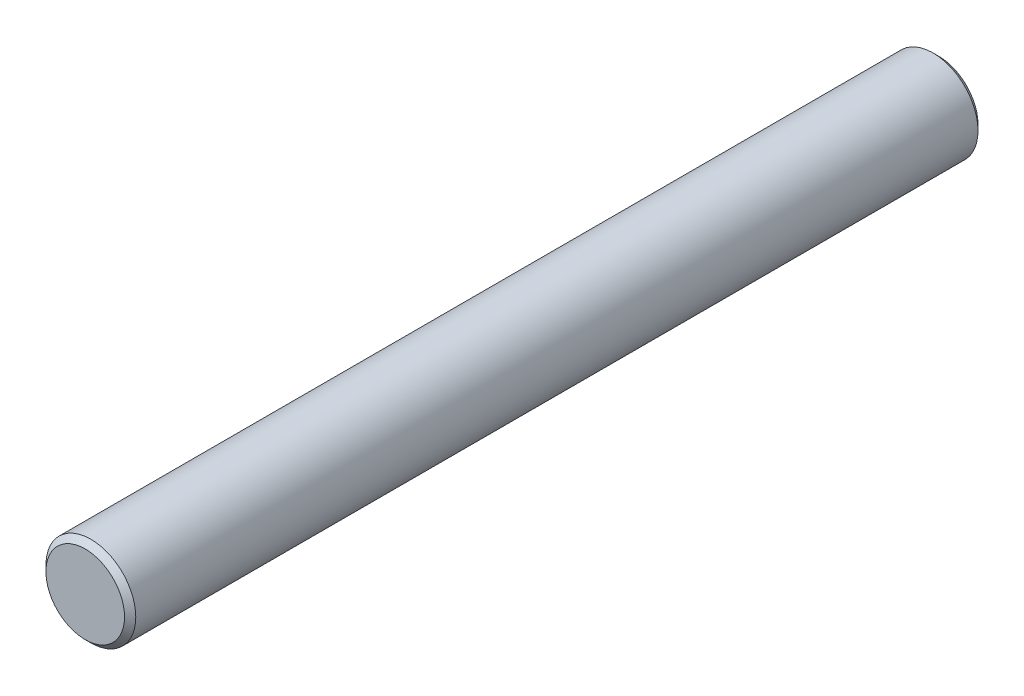
ISO-10303-21;
HEADER;
FILE_DESCRIPTION(('STEP AP214'),'2;1');
FILE_NAME('part.step','',(''),(''),'','','');
FILE_SCHEMA(('AUTOMOTIVE_DESIGN { 1 0 10303 214 1 1 1 1 }'));
ENDSEC;
DATA;
#1=APPLICATION_CONTEXT('core data for automotive mechanical design processes');
#2=APPLICATION_PROTOCOL_DEFINITION('international standard','automotive_design',2000,#1);
#3=PRODUCT_CONTEXT('',#1,'mechanical');
#4=PRODUCT('Part','Part','',(#3));
#5=PRODUCT_RELATED_PRODUCT_CATEGORY('part','',(#4));
#6=PRODUCT_DEFINITION_FORMATION('','',#4);
#7=PRODUCT_DEFINITION_CONTEXT('part definition',#1,'design');
#8=PRODUCT_DEFINITION('design','',#6,#7);
#9=PRODUCT_DEFINITION_SHAPE('','',#8);
#10=(LENGTH_UNIT() NAMED_UNIT(*) SI_UNIT(.MILLI.,.METRE.));
#11=(NAMED_UNIT(*) PLANE_ANGLE_UNIT() SI_UNIT($,.RADIAN.));
#12=(NAMED_UNIT(*) SI_UNIT($,.STERADIAN.) SOLID_ANGLE_UNIT());
#13=UNCERTAINTY_MEASURE_WITH_UNIT(LENGTH_MEASURE(1.E-05),#10,'distance_accuracy_value','');
#14=(GEOMETRIC_REPRESENTATION_CONTEXT(3) GLOBAL_UNCERTAINTY_ASSIGNED_CONTEXT((#13)) GLOBAL_UNIT_ASSIGNED_CONTEXT((#10,
#11,#12)) REPRESENTATION_CONTEXT('',''));
#15=CARTESIAN_POINT('',(0.,0.,0.));
#16=DIRECTION('',(0.,0.,1.));
#17=DIRECTION('',(1.,0.,0.));
#18=AXIS2_PLACEMENT_3D('',#15,#16,#17);
#19=CARTESIAN_POINT('',(0.,0.,-76.));
#20=DIRECTION('',(0.,0.,1.));
#21=DIRECTION('',(1.,0.,0.));
#22=AXIS2_PLACEMENT_3D('',#19,#20,#21);
#23=CYLINDRICAL_SURFACE('',#22,4.);
#24=CARTESIAN_POINT('',(0.,0.,-75.5));
#25=DIRECTION('',(0.,0.,1.));
#26=DIRECTION('',(1.,0.,0.));
#27=AXIS2_PLACEMENT_3D('',#24,#25,#26);
#28=CIRCLE('',#27,4.);
#29=CARTESIAN_POINT('',(4.,0.,-75.5));
#30=VERTEX_POINT('',#29);
#31=EDGE_CURVE('E59',#30,#30,#28,.T.);
#32=ORIENTED_EDGE('',*,*,#31,.T.);
#33=EDGE_LOOP('',(#32));
#34=FACE_BOUND('',#33,.T.);
#35=CARTESIAN_POINT('',(0.,0.,-0.5));
#36=DIRECTION('',(0.,0.,1.));
#37=DIRECTION('',(1.,0.,0.));
#38=AXIS2_PLACEMENT_3D('',#35,#36,#37);
#39=CIRCLE('',#38,4.);
#40=CARTESIAN_POINT('',(4.,0.,-0.5));
#41=VERTEX_POINT('',#40);
#42=EDGE_CURVE('E64',#41,#41,#39,.F.);
#43=ORIENTED_EDGE('',*,*,#42,.T.);
#44=EDGE_LOOP('',(#43));
#45=FACE_BOUND('',#44,.T.);
#46=ADVANCED_FACE('F45',(#34,#45),#23,.T.);
#47=CARTESIAN_POINT('',(0.,0.,-76.));
#48=DIRECTION('',(0.,0.,1.));
#49=DIRECTION('',(1.,0.,0.));
#50=AXIS2_PLACEMENT_3D('',#47,#48,#49);
#51=PLANE('',#50);
#52=CARTESIAN_POINT('',(0.,0.,-76.));
#53=DIRECTION('',(0.,0.,1.));
#54=DIRECTION('',(1.,0.,0.));
#55=AXIS2_PLACEMENT_3D('',#52,#53,#54);
#56=CIRCLE('',#55,3.50000000000002);
#57=CARTESIAN_POINT('',(3.50000000000002,0.,-76.));
#58=VERTEX_POINT('',#57);
#59=EDGE_CURVE('E54',#58,#58,#56,.F.);
#60=ORIENTED_EDGE('',*,*,#59,.T.);
#61=EDGE_LOOP('',(#60));
#62=FACE_BOUND('',#61,.T.);
#63=ADVANCED_FACE('F81',(#62),#51,.F.);
#64=CARTESIAN_POINT('',(0.,0.,0.));
#65=DIRECTION('',(0.,0.,1.));
#66=DIRECTION('',(1.,0.,0.));
#67=AXIS2_PLACEMENT_3D('',#64,#65,#66);
#68=PLANE('',#67);
#69=CARTESIAN_POINT('',(0.,0.,0.));
#70=DIRECTION('',(0.,0.,1.));
#71=DIRECTION('',(1.,0.,0.));
#72=AXIS2_PLACEMENT_3D('',#69,#70,#71);
#73=CIRCLE('',#72,3.5);
#74=CARTESIAN_POINT('',(3.5,0.,0.));
#75=VERTEX_POINT('',#74);
#76=EDGE_CURVE('E10',#75,#75,#73,.T.);
#77=ORIENTED_EDGE('',*,*,#76,.T.);
#78=EDGE_LOOP('',(#77));
#79=FACE_BOUND('',#78,.T.);
#80=ADVANCED_FACE('F78',(#79),#68,.T.);
#81=CARTESIAN_POINT('',(0.,0.,-75.5));
#82=DIRECTION('',(0.,0.,1.));
#83=DIRECTION('',(1.,0.,0.));
#84=AXIS2_PLACEMENT_3D('',#81,#82,#83);
#85=CONICAL_SURFACE('',#84,4.,0.785398163397452);
#86=ORIENTED_EDGE('',*,*,#59,.F.);
#87=EDGE_LOOP('',(#86));
#88=FACE_BOUND('',#87,.T.);
#89=ORIENTED_EDGE('',*,*,#31,.F.);
#90=EDGE_LOOP('',(#89));
#91=FACE_BOUND('',#90,.T.);
#92=ADVANCED_FACE('F74',(#88,#91),#85,.T.);
#93=CARTESIAN_POINT('',(0.,0.,0.));
#94=DIRECTION('',(0.,0.,-1.));
#95=DIRECTION('',(-1.,0.,0.));
#96=AXIS2_PLACEMENT_3D('',#93,#94,#95);
#97=CONICAL_SURFACE('',#96,3.5,0.785398163397452);
#98=ORIENTED_EDGE('',*,*,#42,.F.);
#99=EDGE_LOOP('',(#98));
#100=FACE_BOUND('',#99,.T.);
#101=ORIENTED_EDGE('',*,*,#76,.F.);
#102=EDGE_LOOP('',(#101));
#103=FACE_BOUND('',#102,.T.);
#104=ADVANCED_FACE('F48',(#100,#103),#97,.T.);
#105=CLOSED_SHELL('',(#46,#63,#80,#92,#104));
#106=MANIFOLD_SOLID_BREP('B2',#105);
#107=ADVANCED_BREP_SHAPE_REPRESENTATION('',(#18,#106),#14);
#108=SHAPE_DEFINITION_REPRESENTATION(#9,#107);
ENDSEC;
END-ISO-10303-21;
